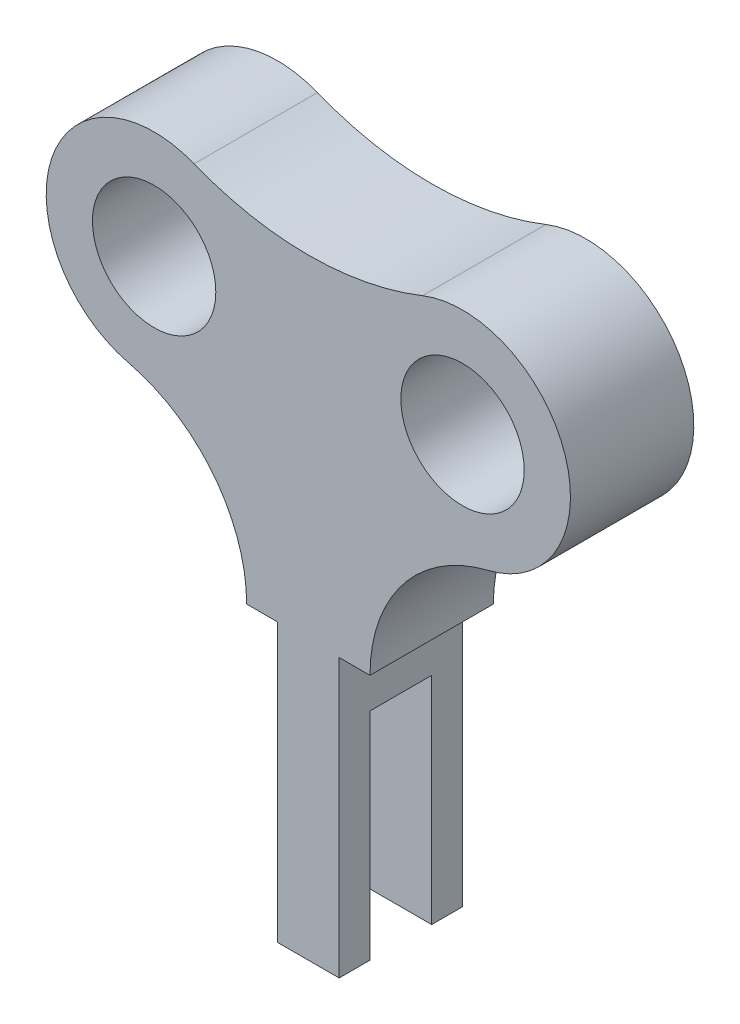
ISO-10303-21;
HEADER;
FILE_DESCRIPTION(('STEP AP214'),'2;1');
FILE_NAME('part.step','',(''),(''),'','','');
FILE_SCHEMA(('AUTOMOTIVE_DESIGN { 1 0 10303 214 1 1 1 1 }'));
ENDSEC;
DATA;
#1=APPLICATION_CONTEXT('core data for automotive mechanical design processes');
#2=APPLICATION_PROTOCOL_DEFINITION('international standard','automotive_design',2000,#1);
#3=PRODUCT_CONTEXT('',#1,'mechanical');
#4=PRODUCT('Part','Part','',(#3));
#5=PRODUCT_RELATED_PRODUCT_CATEGORY('part','',(#4));
#6=PRODUCT_DEFINITION_FORMATION('','',#4);
#7=PRODUCT_DEFINITION_CONTEXT('part definition',#1,'design');
#8=PRODUCT_DEFINITION('design','',#6,#7);
#9=PRODUCT_DEFINITION_SHAPE('','',#8);
#10=(LENGTH_UNIT() NAMED_UNIT(*) SI_UNIT(.MILLI.,.METRE.));
#11=(NAMED_UNIT(*) PLANE_ANGLE_UNIT() SI_UNIT($,.RADIAN.));
#12=(NAMED_UNIT(*) SI_UNIT($,.STERADIAN.) SOLID_ANGLE_UNIT());
#13=UNCERTAINTY_MEASURE_WITH_UNIT(LENGTH_MEASURE(1.E-05),#10,'distance_accuracy_value','');
#14=(GEOMETRIC_REPRESENTATION_CONTEXT(3) GLOBAL_UNCERTAINTY_ASSIGNED_CONTEXT((#13)) GLOBAL_UNIT_ASSIGNED_CONTEXT((#10,
#11,#12)) REPRESENTATION_CONTEXT('',''));
#15=CARTESIAN_POINT('',(0.,0.,0.));
#16=DIRECTION('',(0.,0.,1.));
#17=DIRECTION('',(1.,0.,0.));
#18=AXIS2_PLACEMENT_3D('',#15,#16,#17);
#19=CARTESIAN_POINT('',(0.228806764845223,-86.3067791046458,20.));
#20=DIRECTION('',(0.,1.,0.));
#21=DIRECTION('',(0.,0.,1.));
#22=AXIS2_PLACEMENT_3D('',#19,#20,#21);
#23=PLANE('',#22);
#24=DIRECTION('',(0.,0.,-1.));
#25=VECTOR('',#24,1.);
#26=CARTESIAN_POINT('',(0.228806764845223,-86.3067791046458,20.));
#27=LINE('',#26,#25);
#28=CARTESIAN_POINT('',(0.228806764845223,-86.3067791046458,20.));
#29=VERTEX_POINT('',#28);
#30=CARTESIAN_POINT('',(0.228806764845223,-86.3067791046458,15.));
#31=VERTEX_POINT('',#30);
#32=EDGE_CURVE('E218',#29,#31,#27,.T.);
#33=ORIENTED_EDGE('',*,*,#32,.T.);
#34=DIRECTION('',(1.,0.,0.));
#35=VECTOR('',#34,1.);
#36=CARTESIAN_POINT('',(-9.77119323515478,-86.3067791046458,15.));
#37=LINE('',#36,#35);
#38=CARTESIAN_POINT('',(10.2288067648452,-86.3067791046458,15.));
#39=VERTEX_POINT('',#38);
#40=EDGE_CURVE('E260',#31,#39,#37,.T.);
#41=ORIENTED_EDGE('',*,*,#40,.T.);
#42=DIRECTION('',(0.,0.,-1.));
#43=VECTOR('',#42,1.);
#44=CARTESIAN_POINT('',(10.2288067648452,-86.3067791046458,20.));
#45=LINE('',#44,#43);
#46=CARTESIAN_POINT('',(10.2288067648452,-86.3067791046458,20.));
#47=VERTEX_POINT('',#46);
#48=EDGE_CURVE('E213',#47,#39,#45,.T.);
#49=ORIENTED_EDGE('',*,*,#48,.F.);
#50=DIRECTION('',(1.,0.,0.));
#51=VECTOR('',#50,1.);
#52=CARTESIAN_POINT('',(0.228806764845223,-86.3067791046458,20.));
#53=LINE('',#52,#51);
#54=EDGE_CURVE('E309',#29,#47,#53,.T.);
#55=ORIENTED_EDGE('',*,*,#54,.F.);
#56=EDGE_LOOP('',(#33,#41,#49,#55));
#57=FACE_BOUND('',#56,.T.);
#58=ADVANCED_FACE('F39',(#57),#23,.F.);
#59=CARTESIAN_POINT('',(-29.7711932351548,-41.3067791046458,20.));
#60=DIRECTION('',(0.,0.,1.));
#61=DIRECTION('',(1.,0.,0.));
#62=AXIS2_PLACEMENT_3D('',#59,#60,#61);
#63=PLANE('',#62);
#64=CARTESIAN_POINT('',(-19.7711932351547,0.,20.));
#65=DIRECTION('',(0.,0.,1.));
#66=DIRECTION('',(1.,0.,0.));
#67=AXIS2_PLACEMENT_3D('',#64,#65,#66);
#68=CIRCLE('',#67,10.);
#69=CARTESIAN_POINT('',(-9.77119323515475,0.,20.));
#70=VERTEX_POINT('',#69);
#71=EDGE_CURVE('E170',#70,#70,#68,.T.);
#72=ORIENTED_EDGE('',*,*,#71,.F.);
#73=EDGE_LOOP('',(#72));
#74=FACE_BOUND('',#73,.T.);
#75=CARTESIAN_POINT('',(-29.7711932351548,-41.3067791046458,20.));
#76=DIRECTION('',(0.,0.,-1.));
#77=DIRECTION('',(1.,0.,0.));
#78=AXIS2_PLACEMENT_3D('',#75,#76,#77);
#79=CIRCLE('',#78,25.);
#80=CARTESIAN_POINT('',(-23.8888402939783,-17.0086737489718,20.));
#81=VERTEX_POINT('',#80);
#82=CARTESIAN_POINT('',(-4.7711932351548,-41.3067791046458,20.));
#83=VERTEX_POINT('',#82);
#84=EDGE_CURVE('E197',#81,#83,#79,.T.);
#85=ORIENTED_EDGE('',*,*,#84,.T.);
#86=DIRECTION('',(1.,0.,0.));
#87=VECTOR('',#86,1.);
#88=CARTESIAN_POINT('',(-4.7711932351548,-41.3067791046458,20.));
#89=LINE('',#88,#87);
#90=CARTESIAN_POINT('',(0.228806764845202,-41.3067791046458,20.));
#91=VERTEX_POINT('',#90);
#92=EDGE_CURVE('E111',#83,#91,#89,.T.);
#93=ORIENTED_EDGE('',*,*,#92,.T.);
#94=DIRECTION('',(0.,-1.,0.));
#95=VECTOR('',#94,1.);
#96=CARTESIAN_POINT('',(0.228806764845202,-41.3067791046458,20.));
#97=LINE('',#96,#95);
#98=EDGE_CURVE('E231',#91,#29,#97,.T.);
#99=ORIENTED_EDGE('',*,*,#98,.T.);
#100=ORIENTED_EDGE('',*,*,#54,.T.);
#101=DIRECTION('',(0.,1.,0.));
#102=VECTOR('',#101,1.);
#103=CARTESIAN_POINT('',(10.2288067648452,-41.3067791046458,20.));
#104=LINE('',#103,#102);
#105=CARTESIAN_POINT('',(10.2288067648452,-41.3067791046458,20.));
#106=VERTEX_POINT('',#105);
#107=EDGE_CURVE('E312',#47,#106,#104,.T.);
#108=ORIENTED_EDGE('',*,*,#107,.T.);
#109=DIRECTION('',(1.,0.,0.));
#110=VECTOR('',#109,1.);
#111=CARTESIAN_POINT('',(10.2288067648452,-41.3067791046458,20.));
#112=LINE('',#111,#110);
#113=CARTESIAN_POINT('',(15.2288067648452,-41.3067791046458,20.));
#114=VERTEX_POINT('',#113);
#115=EDGE_CURVE('E315',#106,#114,#112,.T.);
#116=ORIENTED_EDGE('',*,*,#115,.T.);
#117=CARTESIAN_POINT('',(40.2288067648452,-41.3067791046458,20.));
#118=DIRECTION('',(0.,0.,-1.));
#119=DIRECTION('',(1.,0.,0.));
#120=AXIS2_PLACEMENT_3D('',#117,#118,#119);
#121=CIRCLE('',#120,25.);
#122=CARTESIAN_POINT('',(34.3464538236688,-17.0086737489718,20.));
#123=VERTEX_POINT('',#122);
#124=EDGE_CURVE('E140',#114,#123,#121,.T.);
#125=ORIENTED_EDGE('',*,*,#124,.T.);
#126=CARTESIAN_POINT('',(30.2288067648453,0.,20.));
#127=DIRECTION('',(0.,0.,1.));
#128=DIRECTION('',(1.,0.,0.));
#129=AXIS2_PLACEMENT_3D('',#126,#127,#128);
#130=CIRCLE('',#129,17.5);
#131=CARTESIAN_POINT('',(23.7473252833638,16.2554728570169,20.));
#132=VERTEX_POINT('',#131);
#133=EDGE_CURVE('E132',#123,#132,#130,.T.);
#134=ORIENTED_EDGE('',*,*,#133,.T.);
#135=CARTESIAN_POINT('',(5.22880676484525,62.6996810199223,20.));
#136=DIRECTION('',(0.,0.,-1.));
#137=DIRECTION('',(1.,0.,0.));
#138=AXIS2_PLACEMENT_3D('',#135,#136,#137);
#139=CIRCLE('',#138,50.);
#140=CARTESIAN_POINT('',(-13.2897117536733,16.2554728570169,20.));
#141=VERTEX_POINT('',#140);
#142=EDGE_CURVE('E137',#132,#141,#139,.T.);
#143=ORIENTED_EDGE('',*,*,#142,.T.);
#144=CARTESIAN_POINT('',(-19.7711932351547,0.,20.));
#145=DIRECTION('',(0.,0.,1.));
#146=DIRECTION('',(1.,0.,0.));
#147=AXIS2_PLACEMENT_3D('',#144,#145,#146);
#148=CIRCLE('',#147,17.5);
#149=EDGE_CURVE('E64',#141,#81,#148,.T.);
#150=ORIENTED_EDGE('',*,*,#149,.T.);
#151=EDGE_LOOP('',(#85,#93,#99,#100,#108,#116,#125,#134,#143,#150));
#152=FACE_BOUND('',#151,.T.);
#153=CARTESIAN_POINT('',(30.2288067648453,0.,20.));
#154=DIRECTION('',(0.,0.,1.));
#155=DIRECTION('',(1.,0.,0.));
#156=AXIS2_PLACEMENT_3D('',#153,#154,#155);
#157=CIRCLE('',#156,9.99999999999999);
#158=CARTESIAN_POINT('',(40.2288067648452,0.,20.));
#159=VERTEX_POINT('',#158);
#160=EDGE_CURVE('E289',#159,#159,#157,.T.);
#161=ORIENTED_EDGE('',*,*,#160,.F.);
#162=EDGE_LOOP('',(#161));
#163=FACE_BOUND('',#162,.T.);
#164=ADVANCED_FACE('F134',(#74,#152,#163),#63,.T.);
#165=CARTESIAN_POINT('',(-29.7711932351548,-41.3067791046458,0.));
#166=DIRECTION('',(0.,0.,1.));
#167=DIRECTION('',(1.,0.,0.));
#168=AXIS2_PLACEMENT_3D('',#165,#166,#167);
#169=PLANE('',#168);
#170=CARTESIAN_POINT('',(-29.7711932351548,-41.3067791046458,0.));
#171=DIRECTION('',(0.,0.,-1.));
#172=DIRECTION('',(1.,0.,0.));
#173=AXIS2_PLACEMENT_3D('',#170,#171,#172);
#174=CIRCLE('',#173,25.);
#175=CARTESIAN_POINT('',(-23.8888402939783,-17.0086737489718,0.));
#176=VERTEX_POINT('',#175);
#177=CARTESIAN_POINT('',(-4.7711932351548,-41.3067791046458,0.));
#178=VERTEX_POINT('',#177);
#179=EDGE_CURVE('E165',#176,#178,#174,.T.);
#180=ORIENTED_EDGE('',*,*,#179,.F.);
#181=CARTESIAN_POINT('',(-19.7711932351547,0.,0.));
#182=DIRECTION('',(0.,0.,1.));
#183=DIRECTION('',(1.,0.,0.));
#184=AXIS2_PLACEMENT_3D('',#181,#182,#183);
#185=CIRCLE('',#184,17.5);
#186=CARTESIAN_POINT('',(-13.2897117536733,16.2554728570169,0.));
#187=VERTEX_POINT('',#186);
#188=EDGE_CURVE('E103',#187,#176,#185,.T.);
#189=ORIENTED_EDGE('',*,*,#188,.F.);
#190=CARTESIAN_POINT('',(5.22880676484525,62.6996810199223,0.));
#191=DIRECTION('',(0.,0.,-1.));
#192=DIRECTION('',(1.,0.,0.));
#193=AXIS2_PLACEMENT_3D('',#190,#191,#192);
#194=CIRCLE('',#193,50.);
#195=CARTESIAN_POINT('',(23.7473252833638,16.2554728570169,0.));
#196=VERTEX_POINT('',#195);
#197=EDGE_CURVE('E192',#196,#187,#194,.T.);
#198=ORIENTED_EDGE('',*,*,#197,.F.);
#199=CARTESIAN_POINT('',(30.2288067648453,0.,0.));
#200=DIRECTION('',(0.,0.,1.));
#201=DIRECTION('',(1.,0.,0.));
#202=AXIS2_PLACEMENT_3D('',#199,#200,#201);
#203=CIRCLE('',#202,17.5);
#204=CARTESIAN_POINT('',(34.3464538236688,-17.0086737489718,0.));
#205=VERTEX_POINT('',#204);
#206=EDGE_CURVE('E150',#205,#196,#203,.T.);
#207=ORIENTED_EDGE('',*,*,#206,.F.);
#208=CARTESIAN_POINT('',(40.2288067648452,-41.3067791046458,0.));
#209=DIRECTION('',(0.,0.,-1.));
#210=DIRECTION('',(1.,0.,0.));
#211=AXIS2_PLACEMENT_3D('',#208,#209,#210);
#212=CIRCLE('',#211,25.);
#213=CARTESIAN_POINT('',(15.2288067648452,-41.3067791046458,0.));
#214=VERTEX_POINT('',#213);
#215=EDGE_CURVE('E187',#214,#205,#212,.T.);
#216=ORIENTED_EDGE('',*,*,#215,.F.);
#217=DIRECTION('',(1.,0.,0.));
#218=VECTOR('',#217,1.);
#219=CARTESIAN_POINT('',(10.2288067648452,-41.3067791046458,0.));
#220=LINE('',#219,#218);
#221=CARTESIAN_POINT('',(10.2288067648452,-41.3067791046458,0.));
#222=VERTEX_POINT('',#221);
#223=EDGE_CURVE('E184',#222,#214,#220,.T.);
#224=ORIENTED_EDGE('',*,*,#223,.F.);
#225=DIRECTION('',(0.,1.,0.));
#226=VECTOR('',#225,1.);
#227=CARTESIAN_POINT('',(10.2288067648452,-41.3067791046458,0.));
#228=LINE('',#227,#226);
#229=CARTESIAN_POINT('',(10.2288067648452,-86.3067791046458,0.));
#230=VERTEX_POINT('',#229);
#231=EDGE_CURVE('E181',#230,#222,#228,.T.);
#232=ORIENTED_EDGE('',*,*,#231,.F.);
#233=DIRECTION('',(1.,0.,0.));
#234=VECTOR('',#233,1.);
#235=CARTESIAN_POINT('',(0.228806764845223,-86.3067791046458,0.));
#236=LINE('',#235,#234);
#237=CARTESIAN_POINT('',(0.228806764845223,-86.3067791046458,0.));
#238=VERTEX_POINT('',#237);
#239=EDGE_CURVE('E177',#238,#230,#236,.T.);
#240=ORIENTED_EDGE('',*,*,#239,.F.);
#241=DIRECTION('',(0.,-1.,0.));
#242=VECTOR('',#241,1.);
#243=CARTESIAN_POINT('',(0.228806764845202,-41.3067791046458,0.));
#244=LINE('',#243,#242);
#245=CARTESIAN_POINT('',(0.228806764845202,-41.3067791046458,0.));
#246=VERTEX_POINT('',#245);
#247=EDGE_CURVE('E173',#246,#238,#244,.T.);
#248=ORIENTED_EDGE('',*,*,#247,.F.);
#249=DIRECTION('',(1.,0.,0.));
#250=VECTOR('',#249,1.);
#251=CARTESIAN_POINT('',(-4.7711932351548,-41.3067791046458,0.));
#252=LINE('',#251,#250);
#253=EDGE_CURVE('E169',#178,#246,#252,.T.);
#254=ORIENTED_EDGE('',*,*,#253,.F.);
#255=EDGE_LOOP('',(#180,#189,#198,#207,#216,#224,#232,#240,#248,#254));
#256=FACE_BOUND('',#255,.T.);
#257=CARTESIAN_POINT('',(-19.7711932351547,0.,0.));
#258=DIRECTION('',(0.,0.,1.));
#259=DIRECTION('',(1.,0.,0.));
#260=AXIS2_PLACEMENT_3D('',#257,#258,#259);
#261=CIRCLE('',#260,10.);
#262=CARTESIAN_POINT('',(-9.77119323515475,0.,0.));
#263=VERTEX_POINT('',#262);
#264=EDGE_CURVE('E293',#263,#263,#261,.T.);
#265=ORIENTED_EDGE('',*,*,#264,.T.);
#266=EDGE_LOOP('',(#265));
#267=FACE_BOUND('',#266,.T.);
#268=CARTESIAN_POINT('',(30.2288067648453,0.,0.));
#269=DIRECTION('',(0.,0.,1.));
#270=DIRECTION('',(1.,0.,0.));
#271=AXIS2_PLACEMENT_3D('',#268,#269,#270);
#272=CIRCLE('',#271,9.99999999999999);
#273=CARTESIAN_POINT('',(40.2288067648452,0.,0.));
#274=VERTEX_POINT('',#273);
#275=EDGE_CURVE('E288',#274,#274,#272,.T.);
#276=ORIENTED_EDGE('',*,*,#275,.T.);
#277=EDGE_LOOP('',(#276));
#278=FACE_BOUND('',#277,.T.);
#279=ADVANCED_FACE('F234',(#256,#267,#278),#169,.F.);
#280=CARTESIAN_POINT('',(-29.7711932351548,-41.3067791046458,20.));
#281=DIRECTION('',(0.,0.,-1.));
#282=DIRECTION('',(-1.,0.,0.));
#283=AXIS2_PLACEMENT_3D('',#280,#281,#282);
#284=CYLINDRICAL_SURFACE('',#283,25.);
#285=ORIENTED_EDGE('',*,*,#179,.T.);
#286=DIRECTION('',(0.,0.,-1.));
#287=VECTOR('',#286,1.);
#288=CARTESIAN_POINT('',(-4.7711932351548,-41.3067791046458,20.));
#289=LINE('',#288,#287);
#290=EDGE_CURVE('E11',#83,#178,#289,.T.);
#291=ORIENTED_EDGE('',*,*,#290,.F.);
#292=ORIENTED_EDGE('',*,*,#84,.F.);
#293=DIRECTION('',(0.,0.,-1.));
#294=VECTOR('',#293,1.);
#295=CARTESIAN_POINT('',(-23.8888402939783,-17.0086737489718,20.));
#296=LINE('',#295,#294);
#297=EDGE_CURVE('E161',#81,#176,#296,.T.);
#298=ORIENTED_EDGE('',*,*,#297,.T.);
#299=EDGE_LOOP('',(#285,#291,#292,#298));
#300=FACE_BOUND('',#299,.T.);
#301=ADVANCED_FACE('F41',(#300),#284,.F.);
#302=CARTESIAN_POINT('',(-4.7711932351548,-41.3067791046458,20.));
#303=DIRECTION('',(0.,1.,0.));
#304=DIRECTION('',(0.,0.,1.));
#305=AXIS2_PLACEMENT_3D('',#302,#303,#304);
#306=PLANE('',#305);
#307=ORIENTED_EDGE('',*,*,#253,.T.);
#308=DIRECTION('',(0.,0.,-1.));
#309=VECTOR('',#308,1.);
#310=CARTESIAN_POINT('',(0.228806764845202,-41.3067791046458,20.));
#311=LINE('',#310,#309);
#312=EDGE_CURVE('E48',#91,#246,#311,.T.);
#313=ORIENTED_EDGE('',*,*,#312,.F.);
#314=ORIENTED_EDGE('',*,*,#92,.F.);
#315=ORIENTED_EDGE('',*,*,#290,.T.);
#316=EDGE_LOOP('',(#307,#313,#314,#315));
#317=FACE_BOUND('',#316,.T.);
#318=ADVANCED_FACE('F372',(#317),#306,.F.);
#319=CARTESIAN_POINT('',(0.228806764845202,-41.3067791046458,20.));
#320=DIRECTION('',(1.,0.,0.));
#321=DIRECTION('',(0.,1.,0.));
#322=AXIS2_PLACEMENT_3D('',#319,#320,#321);
#323=PLANE('',#322);
#324=DIRECTION('',(0.,0.,1.));
#325=VECTOR('',#324,1.);
#326=CARTESIAN_POINT('',(0.228806764845206,-51.3067791046458,20.));
#327=LINE('',#326,#325);
#328=CARTESIAN_POINT('',(0.228806764845215,-51.3067791046458,5.));
#329=VERTEX_POINT('',#328);
#330=CARTESIAN_POINT('',(0.228806764845206,-51.3067791046458,15.));
#331=VERTEX_POINT('',#330);
#332=EDGE_CURVE('E281',#329,#331,#327,.T.);
#333=ORIENTED_EDGE('',*,*,#332,.T.);
#334=DIRECTION('',(0.,-1.,0.));
#335=VECTOR('',#334,1.);
#336=CARTESIAN_POINT('',(0.228806764845202,-41.3067791046458,15.));
#337=LINE('',#336,#335);
#338=EDGE_CURVE('E284',#331,#31,#337,.T.);
#339=ORIENTED_EDGE('',*,*,#338,.T.);
#340=ORIENTED_EDGE('',*,*,#32,.F.);
#341=ORIENTED_EDGE('',*,*,#98,.F.);
#342=ORIENTED_EDGE('',*,*,#312,.T.);
#343=ORIENTED_EDGE('',*,*,#247,.T.);
#344=CARTESIAN_POINT('',(0.228806764845223,-86.3067791046458,5.));
#345=VERTEX_POINT('',#344);
#346=EDGE_CURVE('E217',#345,#238,#27,.T.);
#347=ORIENTED_EDGE('',*,*,#346,.F.);
#348=DIRECTION('',(0.,1.,0.));
#349=VECTOR('',#348,1.);
#350=CARTESIAN_POINT('',(0.228806764845202,-41.3067791046458,5.));
#351=LINE('',#350,#349);
#352=EDGE_CURVE('E269',#345,#329,#351,.T.);
#353=ORIENTED_EDGE('',*,*,#352,.T.);
#354=EDGE_LOOP('',(#333,#339,#340,#341,#342,#343,#347,#353));
#355=FACE_BOUND('',#354,.T.);
#356=ADVANCED_FACE('F227',(#355),#323,.F.);
#357=CARTESIAN_POINT('',(10.2288067648452,-86.3067791046458,5.));
#358=VERTEX_POINT('',#357);
#359=EDGE_CURVE('E212',#358,#230,#45,.T.);
#360=ORIENTED_EDGE('',*,*,#359,.F.);
#361=DIRECTION('',(1.,0.,0.));
#362=VECTOR('',#361,1.);
#363=CARTESIAN_POINT('',(-9.77119323515478,-86.3067791046458,5.));
#364=LINE('',#363,#362);
#365=EDGE_CURVE('E55',#345,#358,#364,.T.);
#366=ORIENTED_EDGE('',*,*,#365,.F.);
#367=ORIENTED_EDGE('',*,*,#346,.T.);
#368=ORIENTED_EDGE('',*,*,#239,.T.);
#369=EDGE_LOOP('',(#360,#366,#367,#368));
#370=FACE_BOUND('',#369,.T.);
#371=ADVANCED_FACE('F240',(#370),#23,.F.);
#372=CARTESIAN_POINT('',(10.2288067648452,-41.3067791046458,20.));
#373=DIRECTION('',(-1.,0.,0.));
#374=DIRECTION('',(0.,-1.,0.));
#375=AXIS2_PLACEMENT_3D('',#372,#373,#374);
#376=PLANE('',#375);
#377=ORIENTED_EDGE('',*,*,#48,.T.);
#378=DIRECTION('',(0.,-1.,0.));
#379=VECTOR('',#378,1.);
#380=CARTESIAN_POINT('',(10.2288067648452,-86.3067791046458,15.));
#381=LINE('',#380,#379);
#382=CARTESIAN_POINT('',(10.2288067648452,-51.3067791046458,15.));
#383=VERTEX_POINT('',#382);
#384=EDGE_CURVE('E256',#383,#39,#381,.T.);
#385=ORIENTED_EDGE('',*,*,#384,.F.);
#386=DIRECTION('',(0.,0.,1.));
#387=VECTOR('',#386,1.);
#388=CARTESIAN_POINT('',(10.2288067648452,-51.3067791046458,15.));
#389=LINE('',#388,#387);
#390=CARTESIAN_POINT('',(10.2288067648452,-51.3067791046458,5.));
#391=VERTEX_POINT('',#390);
#392=EDGE_CURVE('E253',#391,#383,#389,.T.);
#393=ORIENTED_EDGE('',*,*,#392,.F.);
#394=DIRECTION('',(0.,1.,0.));
#395=VECTOR('',#394,1.);
#396=CARTESIAN_POINT('',(10.2288067648452,-86.3067791046458,5.));
#397=LINE('',#396,#395);
#398=EDGE_CURVE('E249',#358,#391,#397,.T.);
#399=ORIENTED_EDGE('',*,*,#398,.F.);
#400=ORIENTED_EDGE('',*,*,#359,.T.);
#401=ORIENTED_EDGE('',*,*,#231,.T.);
#402=DIRECTION('',(0.,0.,-1.));
#403=VECTOR('',#402,1.);
#404=CARTESIAN_POINT('',(10.2288067648452,-41.3067791046458,20.));
#405=LINE('',#404,#403);
#406=EDGE_CURVE('E208',#106,#222,#405,.T.);
#407=ORIENTED_EDGE('',*,*,#406,.F.);
#408=ORIENTED_EDGE('',*,*,#107,.F.);
#409=EDGE_LOOP('',(#377,#385,#393,#399,#400,#401,#407,#408));
#410=FACE_BOUND('',#409,.T.);
#411=ADVANCED_FACE('F246',(#410),#376,.F.);
#412=CARTESIAN_POINT('',(10.2288067648452,-41.3067791046458,20.));
#413=DIRECTION('',(0.,1.,0.));
#414=DIRECTION('',(0.,0.,1.));
#415=AXIS2_PLACEMENT_3D('',#412,#413,#414);
#416=PLANE('',#415);
#417=ORIENTED_EDGE('',*,*,#223,.T.);
#418=DIRECTION('',(0.,0.,-1.));
#419=VECTOR('',#418,1.);
#420=CARTESIAN_POINT('',(15.2288067648452,-41.3067791046458,20.));
#421=LINE('',#420,#419);
#422=EDGE_CURVE('E204',#114,#214,#421,.T.);
#423=ORIENTED_EDGE('',*,*,#422,.F.);
#424=ORIENTED_EDGE('',*,*,#115,.F.);
#425=ORIENTED_EDGE('',*,*,#406,.T.);
#426=EDGE_LOOP('',(#417,#423,#424,#425));
#427=FACE_BOUND('',#426,.T.);
#428=ADVANCED_FACE('F322',(#427),#416,.F.);
#429=CARTESIAN_POINT('',(40.2288067648452,-41.3067791046458,20.));
#430=DIRECTION('',(0.,0.,-1.));
#431=DIRECTION('',(-1.,0.,0.));
#432=AXIS2_PLACEMENT_3D('',#429,#430,#431);
#433=CYLINDRICAL_SURFACE('',#432,25.);
#434=ORIENTED_EDGE('',*,*,#215,.T.);
#435=DIRECTION('',(0.,0.,-1.));
#436=VECTOR('',#435,1.);
#437=CARTESIAN_POINT('',(34.3464538236688,-17.0086737489718,20.));
#438=LINE('',#437,#436);
#439=EDGE_CURVE('E154',#123,#205,#438,.T.);
#440=ORIENTED_EDGE('',*,*,#439,.F.);
#441=ORIENTED_EDGE('',*,*,#124,.F.);
#442=ORIENTED_EDGE('',*,*,#422,.T.);
#443=EDGE_LOOP('',(#434,#440,#441,#442));
#444=FACE_BOUND('',#443,.T.);
#445=ADVANCED_FACE('F325',(#444),#433,.F.);
#446=CARTESIAN_POINT('',(30.2288067648453,0.,20.));
#447=DIRECTION('',(0.,0.,-1.));
#448=DIRECTION('',(-1.,0.,0.));
#449=AXIS2_PLACEMENT_3D('',#446,#447,#448);
#450=CYLINDRICAL_SURFACE('',#449,17.5);
#451=ORIENTED_EDGE('',*,*,#206,.T.);
#452=DIRECTION('',(0.,0.,-1.));
#453=VECTOR('',#452,1.);
#454=CARTESIAN_POINT('',(23.7473252833638,16.2554728570169,20.));
#455=LINE('',#454,#453);
#456=EDGE_CURVE('E147',#132,#196,#455,.T.);
#457=ORIENTED_EDGE('',*,*,#456,.F.);
#458=ORIENTED_EDGE('',*,*,#133,.F.);
#459=ORIENTED_EDGE('',*,*,#439,.T.);
#460=EDGE_LOOP('',(#451,#457,#458,#459));
#461=FACE_BOUND('',#460,.T.);
#462=ADVANCED_FACE('F148',(#461),#450,.T.);
#463=CARTESIAN_POINT('',(5.22880676484525,62.6996810199223,20.));
#464=DIRECTION('',(0.,0.,-1.));
#465=DIRECTION('',(-1.,0.,0.));
#466=AXIS2_PLACEMENT_3D('',#463,#464,#465);
#467=CYLINDRICAL_SURFACE('',#466,50.);
#468=ORIENTED_EDGE('',*,*,#197,.T.);
#469=DIRECTION('',(0.,0.,-1.));
#470=VECTOR('',#469,1.);
#471=CARTESIAN_POINT('',(-13.2897117536733,16.2554728570169,20.));
#472=LINE('',#471,#470);
#473=EDGE_CURVE('E155',#141,#187,#472,.T.);
#474=ORIENTED_EDGE('',*,*,#473,.F.);
#475=ORIENTED_EDGE('',*,*,#142,.F.);
#476=ORIENTED_EDGE('',*,*,#456,.T.);
#477=EDGE_LOOP('',(#468,#474,#475,#476));
#478=FACE_BOUND('',#477,.T.);
#479=ADVANCED_FACE('F157',(#478),#467,.F.);
#480=CARTESIAN_POINT('',(-19.7711932351547,0.,20.));
#481=DIRECTION('',(0.,0.,-1.));
#482=DIRECTION('',(-1.,0.,0.));
#483=AXIS2_PLACEMENT_3D('',#480,#481,#482);
#484=CYLINDRICAL_SURFACE('',#483,17.5);
#485=ORIENTED_EDGE('',*,*,#188,.T.);
#486=ORIENTED_EDGE('',*,*,#297,.F.);
#487=ORIENTED_EDGE('',*,*,#149,.F.);
#488=ORIENTED_EDGE('',*,*,#473,.T.);
#489=EDGE_LOOP('',(#485,#486,#487,#488));
#490=FACE_BOUND('',#489,.T.);
#491=ADVANCED_FACE('F326',(#490),#484,.T.);
#492=CARTESIAN_POINT('',(-19.7711932351547,0.,20.));
#493=DIRECTION('',(0.,0.,-1.));
#494=DIRECTION('',(-1.,0.,0.));
#495=AXIS2_PLACEMENT_3D('',#492,#493,#494);
#496=CYLINDRICAL_SURFACE('',#495,10.);
#497=ORIENTED_EDGE('',*,*,#71,.T.);
#498=EDGE_LOOP('',(#497));
#499=FACE_BOUND('',#498,.T.);
#500=ORIENTED_EDGE('',*,*,#264,.F.);
#501=EDGE_LOOP('',(#500));
#502=FACE_BOUND('',#501,.T.);
#503=ADVANCED_FACE('F389',(#499,#502),#496,.F.);
#504=CARTESIAN_POINT('',(30.2288067648453,0.,20.));
#505=DIRECTION('',(0.,0.,-1.));
#506=DIRECTION('',(-1.,0.,0.));
#507=AXIS2_PLACEMENT_3D('',#504,#505,#506);
#508=CYLINDRICAL_SURFACE('',#507,9.99999999999999);
#509=ORIENTED_EDGE('',*,*,#160,.T.);
#510=EDGE_LOOP('',(#509));
#511=FACE_BOUND('',#510,.T.);
#512=ORIENTED_EDGE('',*,*,#275,.F.);
#513=EDGE_LOOP('',(#512));
#514=FACE_BOUND('',#513,.T.);
#515=ADVANCED_FACE('F423',(#511,#514),#508,.F.);
#516=CARTESIAN_POINT('',(-9.77119323515478,-86.3067791046458,15.));
#517=DIRECTION('',(0.,0.,1.));
#518=DIRECTION('',(1.,0.,0.));
#519=AXIS2_PLACEMENT_3D('',#516,#517,#518);
#520=PLANE('',#519);
#521=DIRECTION('',(1.,0.,0.));
#522=VECTOR('',#521,1.);
#523=CARTESIAN_POINT('',(-9.77119323515479,-51.3067791046458,15.));
#524=LINE('',#523,#522);
#525=EDGE_CURVE('E265',#331,#383,#524,.T.);
#526=ORIENTED_EDGE('',*,*,#525,.T.);
#527=ORIENTED_EDGE('',*,*,#384,.T.);
#528=ORIENTED_EDGE('',*,*,#40,.F.);
#529=ORIENTED_EDGE('',*,*,#338,.F.);
#530=EDGE_LOOP('',(#526,#527,#528,#529));
#531=FACE_BOUND('',#530,.T.);
#532=ADVANCED_FACE('F348',(#531),#520,.F.);
#533=CARTESIAN_POINT('',(-9.77119323515479,-51.3067791046458,15.));
#534=DIRECTION('',(0.,1.,0.));
#535=DIRECTION('',(-1.,0.,0.));
#536=AXIS2_PLACEMENT_3D('',#533,#534,#535);
#537=PLANE('',#536);
#538=DIRECTION('',(1.,0.,0.));
#539=VECTOR('',#538,1.);
#540=CARTESIAN_POINT('',(-9.77119323515479,-51.3067791046458,5.));
#541=LINE('',#540,#539);
#542=EDGE_CURVE('E270',#329,#391,#541,.T.);
#543=ORIENTED_EDGE('',*,*,#542,.T.);
#544=ORIENTED_EDGE('',*,*,#392,.T.);
#545=ORIENTED_EDGE('',*,*,#525,.F.);
#546=ORIENTED_EDGE('',*,*,#332,.F.);
#547=EDGE_LOOP('',(#543,#544,#545,#546));
#548=FACE_BOUND('',#547,.T.);
#549=ADVANCED_FACE('F349',(#548),#537,.F.);
#550=CARTESIAN_POINT('',(-9.77119323515478,-86.3067791046458,5.));
#551=DIRECTION('',(0.,0.,-1.));
#552=DIRECTION('',(-1.,0.,0.));
#553=AXIS2_PLACEMENT_3D('',#550,#551,#552);
#554=PLANE('',#553);
#555=ORIENTED_EDGE('',*,*,#365,.T.);
#556=ORIENTED_EDGE('',*,*,#398,.T.);
#557=ORIENTED_EDGE('',*,*,#542,.F.);
#558=ORIENTED_EDGE('',*,*,#352,.F.);
#559=EDGE_LOOP('',(#555,#556,#557,#558));
#560=FACE_BOUND('',#559,.T.);
#561=ADVANCED_FACE('F350',(#560),#554,.F.);
#562=CLOSED_SHELL('',(#58,#164,#279,#301,#318,#356,#371,#411,#428,#445,#462,#479,#491,#503,#515,
#532,#549,#561));
#563=MANIFOLD_SOLID_BREP('B2',#562);
#564=ADVANCED_BREP_SHAPE_REPRESENTATION('',(#18,#563),#14);
#565=SHAPE_DEFINITION_REPRESENTATION(#9,#564);
ENDSEC;
END-ISO-10303-21;
